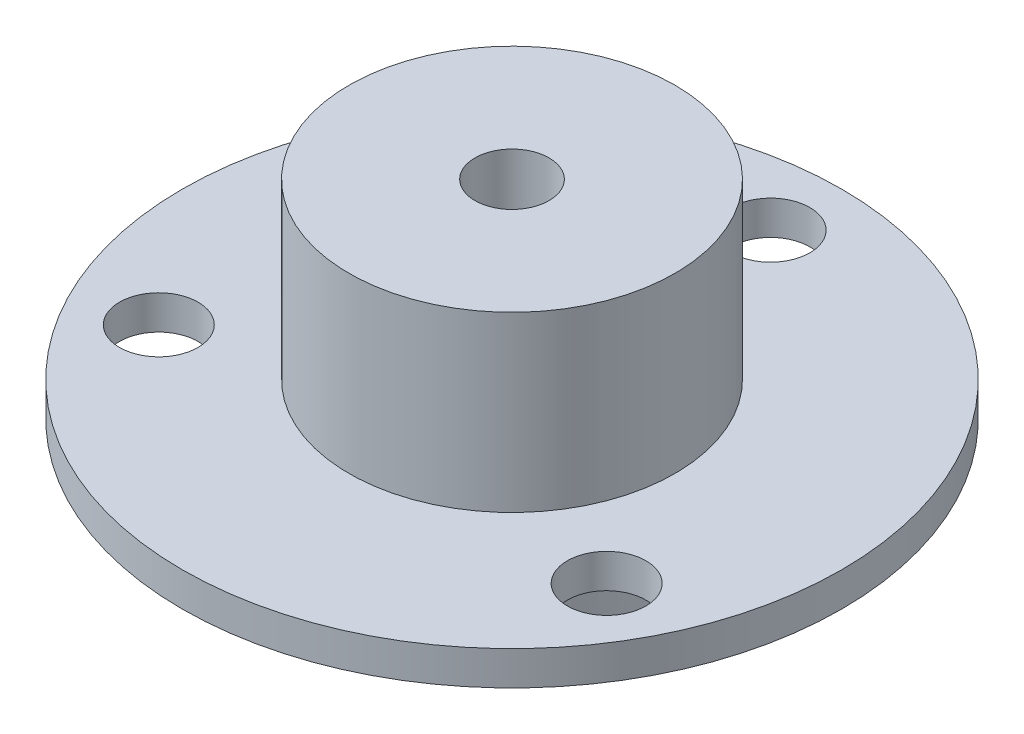
ISO-10303-21;
HEADER;
FILE_DESCRIPTION(('STEP AP214'),'2;1');
FILE_NAME('part.step','',(''),(''),'','','');
FILE_SCHEMA(('AUTOMOTIVE_DESIGN { 1 0 10303 214 1 1 1 1 }'));
ENDSEC;
DATA;
#1=APPLICATION_CONTEXT('core data for automotive mechanical design processes');
#2=APPLICATION_PROTOCOL_DEFINITION('international standard','automotive_design',2000,#1);
#3=PRODUCT_CONTEXT('',#1,'mechanical');
#4=PRODUCT('Part','Part','',(#3));
#5=PRODUCT_RELATED_PRODUCT_CATEGORY('part','',(#4));
#6=PRODUCT_DEFINITION_FORMATION('','',#4);
#7=PRODUCT_DEFINITION_CONTEXT('part definition',#1,'design');
#8=PRODUCT_DEFINITION('design','',#6,#7);
#9=PRODUCT_DEFINITION_SHAPE('','',#8);
#10=(LENGTH_UNIT() NAMED_UNIT(*) SI_UNIT(.MILLI.,.METRE.));
#11=(NAMED_UNIT(*) PLANE_ANGLE_UNIT() SI_UNIT($,.RADIAN.));
#12=(NAMED_UNIT(*) SI_UNIT($,.STERADIAN.) SOLID_ANGLE_UNIT());
#13=UNCERTAINTY_MEASURE_WITH_UNIT(LENGTH_MEASURE(1.E-05),#10,'distance_accuracy_value','');
#14=(GEOMETRIC_REPRESENTATION_CONTEXT(3) GLOBAL_UNCERTAINTY_ASSIGNED_CONTEXT((#13)) GLOBAL_UNIT_ASSIGNED_CONTEXT((#10,
#11,#12)) REPRESENTATION_CONTEXT('',''));
#15=CARTESIAN_POINT('',(0.,0.,0.));
#16=DIRECTION('',(0.,0.,1.));
#17=DIRECTION('',(1.,0.,0.));
#18=AXIS2_PLACEMENT_3D('',#15,#16,#17);
#19=CARTESIAN_POINT('',(0.,0.,0.));
#20=DIRECTION('',(0.,-1.,0.));
#21=DIRECTION('',(0.,0.,-1.));
#22=AXIS2_PLACEMENT_3D('',#19,#20,#21);
#23=CYLINDRICAL_SURFACE('',#22,2.5);
#24=CARTESIAN_POINT('',(0.,0.,0.));
#25=DIRECTION('',(0.,-1.,0.));
#26=DIRECTION('',(0.,0.,-1.));
#27=AXIS2_PLACEMENT_3D('',#24,#25,#26);
#28=CIRCLE('',#27,2.5);
#29=CARTESIAN_POINT('',(0.,0.,-2.5));
#30=VERTEX_POINT('',#29);
#31=EDGE_CURVE('E66',#30,#30,#28,.T.);
#32=ORIENTED_EDGE('',*,*,#31,.T.);
#33=EDGE_LOOP('',(#32));
#34=FACE_BOUND('',#33,.T.);
#35=CARTESIAN_POINT('',(0.,19.,0.));
#36=DIRECTION('',(0.,-1.,0.));
#37=DIRECTION('',(0.,0.,-1.));
#38=AXIS2_PLACEMENT_3D('',#35,#36,#37);
#39=CIRCLE('',#38,2.5);
#40=CARTESIAN_POINT('',(0.,19.,-2.5));
#41=VERTEX_POINT('',#40);
#42=EDGE_CURVE('E10',#41,#41,#39,.T.);
#43=ORIENTED_EDGE('',*,*,#42,.F.);
#44=EDGE_LOOP('',(#43));
#45=FACE_BOUND('',#44,.T.);
#46=ADVANCED_FACE('F37',(#34,#45),#23,.F.);
#47=CARTESIAN_POINT('',(0.,19.,0.));
#48=DIRECTION('',(0.,-1.,0.));
#49=DIRECTION('',(0.,0.,-1.));
#50=AXIS2_PLACEMENT_3D('',#47,#48,#49);
#51=PLANE('',#50);
#52=CARTESIAN_POINT('',(0.,19.,0.));
#53=DIRECTION('',(0.,-1.,0.));
#54=DIRECTION('',(0.,0.,-1.));
#55=AXIS2_PLACEMENT_3D('',#52,#53,#54);
#56=CIRCLE('',#55,11.);
#57=CARTESIAN_POINT('',(0.,19.,-11.));
#58=VERTEX_POINT('',#57);
#59=EDGE_CURVE('E45',#58,#58,#56,.T.);
#60=ORIENTED_EDGE('',*,*,#59,.F.);
#61=EDGE_LOOP('',(#60));
#62=FACE_BOUND('',#61,.T.);
#63=ORIENTED_EDGE('',*,*,#42,.T.);
#64=EDGE_LOOP('',(#63));
#65=FACE_BOUND('',#64,.T.);
#66=ADVANCED_FACE('F102',(#62,#65),#51,.F.);
#67=CARTESIAN_POINT('',(0.,0.,0.));
#68=DIRECTION('',(0.,-1.,0.));
#69=DIRECTION('',(0.,0.,-1.));
#70=AXIS2_PLACEMENT_3D('',#67,#68,#69);
#71=CYLINDRICAL_SURFACE('',#70,11.);
#72=CARTESIAN_POINT('',(0.,7.3,0.));
#73=DIRECTION('',(0.,-1.,0.));
#74=DIRECTION('',(0.,0.,-1.));
#75=AXIS2_PLACEMENT_3D('',#72,#73,#74);
#76=CIRCLE('',#75,11.);
#77=CARTESIAN_POINT('',(0.,7.3,-11.));
#78=VERTEX_POINT('',#77);
#79=EDGE_CURVE('E51',#78,#78,#76,.T.);
#80=ORIENTED_EDGE('',*,*,#79,.F.);
#81=EDGE_LOOP('',(#80));
#82=FACE_BOUND('',#81,.T.);
#83=ORIENTED_EDGE('',*,*,#59,.T.);
#84=EDGE_LOOP('',(#83));
#85=FACE_BOUND('',#84,.T.);
#86=ADVANCED_FACE('F99',(#82,#85),#71,.T.);
#87=CARTESIAN_POINT('',(0.,7.3,0.));
#88=DIRECTION('',(0.,-1.,0.));
#89=DIRECTION('',(0.,0.,-1.));
#90=AXIS2_PLACEMENT_3D('',#87,#88,#89);
#91=PLANE('',#90);
#92=CARTESIAN_POINT('',(0.,7.3,-17.45));
#93=DIRECTION('',(0.,1.,0.));
#94=DIRECTION('',(0.,0.,1.));
#95=AXIS2_PLACEMENT_3D('',#92,#93,#94);
#96=CIRCLE('',#95,2.65);
#97=CARTESIAN_POINT('',(0.,7.3,-14.8));
#98=VERTEX_POINT('',#97);
#99=EDGE_CURVE('E59',#98,#98,#96,.T.);
#100=ORIENTED_EDGE('',*,*,#99,.F.);
#101=EDGE_LOOP('',(#100));
#102=FACE_BOUND('',#101,.T.);
#103=CARTESIAN_POINT('',(15.1121432960385,7.3,8.725));
#104=DIRECTION('',(0.,1.,0.));
#105=DIRECTION('',(0.,0.,1.));
#106=AXIS2_PLACEMENT_3D('',#103,#104,#105);
#107=CIRCLE('',#106,2.65);
#108=CARTESIAN_POINT('',(15.1121432960385,7.3,11.375));
#109=VERTEX_POINT('',#108);
#110=EDGE_CURVE('E146',#109,#109,#107,.T.);
#111=ORIENTED_EDGE('',*,*,#110,.F.);
#112=EDGE_LOOP('',(#111));
#113=FACE_BOUND('',#112,.T.);
#114=CARTESIAN_POINT('',(-15.1121432960385,7.3,8.72500000000001));
#115=DIRECTION('',(0.,1.,0.));
#116=DIRECTION('',(0.,0.,1.));
#117=AXIS2_PLACEMENT_3D('',#114,#115,#116);
#118=CIRCLE('',#117,2.65);
#119=CARTESIAN_POINT('',(-15.1121432960385,7.3,11.375));
#120=VERTEX_POINT('',#119);
#121=EDGE_CURVE('E80',#120,#120,#118,.T.);
#122=ORIENTED_EDGE('',*,*,#121,.F.);
#123=EDGE_LOOP('',(#122));
#124=FACE_BOUND('',#123,.T.);
#125=CARTESIAN_POINT('',(0.,7.3,0.));
#126=DIRECTION('',(0.,-1.,0.));
#127=DIRECTION('',(0.,0.,-1.));
#128=AXIS2_PLACEMENT_3D('',#125,#126,#127);
#129=CIRCLE('',#128,22.25);
#130=CARTESIAN_POINT('',(0.,7.3,-22.25));
#131=VERTEX_POINT('',#130);
#132=EDGE_CURVE('E90',#131,#131,#129,.T.);
#133=ORIENTED_EDGE('',*,*,#132,.F.);
#134=EDGE_LOOP('',(#133));
#135=FACE_BOUND('',#134,.T.);
#136=ORIENTED_EDGE('',*,*,#79,.T.);
#137=EDGE_LOOP('',(#136));
#138=FACE_BOUND('',#137,.T.);
#139=ADVANCED_FACE('F97',(#102,#113,#124,#135,#138),#91,.F.);
#140=CARTESIAN_POINT('',(0.,0.,0.));
#141=DIRECTION('',(0.,-1.,0.));
#142=DIRECTION('',(0.,0.,-1.));
#143=AXIS2_PLACEMENT_3D('',#140,#141,#142);
#144=CYLINDRICAL_SURFACE('',#143,22.25);
#145=CARTESIAN_POINT('',(0.,5.,0.));
#146=DIRECTION('',(0.,-1.,0.));
#147=DIRECTION('',(0.,0.,-1.));
#148=AXIS2_PLACEMENT_3D('',#145,#146,#147);
#149=CIRCLE('',#148,22.25);
#150=CARTESIAN_POINT('',(0.,5.,-22.25));
#151=VERTEX_POINT('',#150);
#152=EDGE_CURVE('E86',#151,#151,#149,.T.);
#153=ORIENTED_EDGE('',*,*,#152,.F.);
#154=EDGE_LOOP('',(#153));
#155=FACE_BOUND('',#154,.T.);
#156=ORIENTED_EDGE('',*,*,#132,.T.);
#157=EDGE_LOOP('',(#156));
#158=FACE_BOUND('',#157,.T.);
#159=ADVANCED_FACE('F113',(#155,#158),#144,.T.);
#160=CARTESIAN_POINT('',(0.,5.,0.));
#161=DIRECTION('',(0.,1.,0.));
#162=DIRECTION('',(0.,0.,1.));
#163=AXIS2_PLACEMENT_3D('',#160,#161,#162);
#164=PLANE('',#163);
#165=CARTESIAN_POINT('',(0.,5.,-17.45));
#166=DIRECTION('',(0.,1.,0.));
#167=DIRECTION('',(0.,0.,1.));
#168=AXIS2_PLACEMENT_3D('',#165,#166,#167);
#169=CIRCLE('',#168,2.65);
#170=CARTESIAN_POINT('',(0.,5.,-14.8));
#171=VERTEX_POINT('',#170);
#172=EDGE_CURVE('E40',#171,#171,#169,.T.);
#173=ORIENTED_EDGE('',*,*,#172,.T.);
#174=EDGE_LOOP('',(#173));
#175=FACE_BOUND('',#174,.T.);
#176=CARTESIAN_POINT('',(15.1121432960385,5.,8.725));
#177=DIRECTION('',(0.,1.,0.));
#178=DIRECTION('',(0.,0.,1.));
#179=AXIS2_PLACEMENT_3D('',#176,#177,#178);
#180=CIRCLE('',#179,2.65);
#181=CARTESIAN_POINT('',(15.1121432960385,5.,11.375));
#182=VERTEX_POINT('',#181);
#183=EDGE_CURVE('E58',#182,#182,#180,.T.);
#184=ORIENTED_EDGE('',*,*,#183,.T.);
#185=EDGE_LOOP('',(#184));
#186=FACE_BOUND('',#185,.T.);
#187=CARTESIAN_POINT('',(-15.1121432960385,5.,8.72500000000001));
#188=DIRECTION('',(0.,1.,0.));
#189=DIRECTION('',(0.,0.,1.));
#190=AXIS2_PLACEMENT_3D('',#187,#188,#189);
#191=CIRCLE('',#190,2.65);
#192=CARTESIAN_POINT('',(-15.1121432960385,5.,11.375));
#193=VERTEX_POINT('',#192);
#194=EDGE_CURVE('E55',#193,#193,#191,.T.);
#195=ORIENTED_EDGE('',*,*,#194,.T.);
#196=EDGE_LOOP('',(#195));
#197=FACE_BOUND('',#196,.T.);
#198=CARTESIAN_POINT('',(0.,5.,0.));
#199=DIRECTION('',(0.,-1.,0.));
#200=DIRECTION('',(0.,0.,-1.));
#201=AXIS2_PLACEMENT_3D('',#198,#199,#200);
#202=CIRCLE('',#201,11.);
#203=CARTESIAN_POINT('',(0.,5.,-11.));
#204=VERTEX_POINT('',#203);
#205=EDGE_CURVE('E77',#204,#204,#202,.T.);
#206=ORIENTED_EDGE('',*,*,#205,.F.);
#207=EDGE_LOOP('',(#206));
#208=FACE_BOUND('',#207,.T.);
#209=ORIENTED_EDGE('',*,*,#152,.T.);
#210=EDGE_LOOP('',(#209));
#211=FACE_BOUND('',#210,.T.);
#212=ADVANCED_FACE('F117',(#175,#186,#197,#208,#211),#164,.F.);
#213=CARTESIAN_POINT('',(0.,0.,0.));
#214=DIRECTION('',(0.,-1.,0.));
#215=DIRECTION('',(0.,0.,-1.));
#216=AXIS2_PLACEMENT_3D('',#213,#214,#215);
#217=CYLINDRICAL_SURFACE('',#216,11.);
#218=CARTESIAN_POINT('',(0.,0.,0.));
#219=DIRECTION('',(0.,-1.,0.));
#220=DIRECTION('',(0.,0.,-1.));
#221=AXIS2_PLACEMENT_3D('',#218,#219,#220);
#222=CIRCLE('',#221,11.);
#223=CARTESIAN_POINT('',(0.,0.,-11.));
#224=VERTEX_POINT('',#223);
#225=EDGE_CURVE('E71',#224,#224,#222,.T.);
#226=ORIENTED_EDGE('',*,*,#225,.F.);
#227=EDGE_LOOP('',(#226));
#228=FACE_BOUND('',#227,.T.);
#229=ORIENTED_EDGE('',*,*,#205,.T.);
#230=EDGE_LOOP('',(#229));
#231=FACE_BOUND('',#230,.T.);
#232=ADVANCED_FACE('F121',(#228,#231),#217,.T.);
#233=CARTESIAN_POINT('',(0.,0.,0.));
#234=DIRECTION('',(0.,1.,0.));
#235=DIRECTION('',(0.,0.,1.));
#236=AXIS2_PLACEMENT_3D('',#233,#234,#235);
#237=PLANE('',#236);
#238=ORIENTED_EDGE('',*,*,#31,.F.);
#239=EDGE_LOOP('',(#238));
#240=FACE_BOUND('',#239,.T.);
#241=ORIENTED_EDGE('',*,*,#225,.T.);
#242=EDGE_LOOP('',(#241));
#243=FACE_BOUND('',#242,.T.);
#244=ADVANCED_FACE('F124',(#240,#243),#237,.F.);
#245=CARTESIAN_POINT('',(-15.1121432960385,0.,8.72500000000001));
#246=DIRECTION('',(0.,1.,0.));
#247=DIRECTION('',(0.,0.,1.));
#248=AXIS2_PLACEMENT_3D('',#245,#246,#247);
#249=CYLINDRICAL_SURFACE('',#248,2.65);
#250=CARTESIAN_POINT('',(-15.1121432960385,7.3,11.375));
#251=CARTESIAN_POINT('',(-15.1121432960385,7.27604166666667,11.375));
#252=CARTESIAN_POINT('',(-15.1121432960385,7.25208333333333,11.375));
#253=CARTESIAN_POINT('',(-15.1121432960385,7.20416666666667,11.375));
#254=CARTESIAN_POINT('',(-15.1121432960385,7.18020833333333,11.375));
#255=CARTESIAN_POINT('',(-15.1121432960385,7.13229166666667,11.375));
#256=CARTESIAN_POINT('',(-15.1121432960385,7.10833333333333,11.375));
#257=CARTESIAN_POINT('',(-15.1121432960385,7.06041666666667,11.375));
#258=CARTESIAN_POINT('',(-15.1121432960385,7.03645833333333,11.375));
#259=CARTESIAN_POINT('',(-15.1121432960385,6.98854166666667,11.375));
#260=CARTESIAN_POINT('',(-15.1121432960385,6.96458333333333,11.375));
#261=CARTESIAN_POINT('',(-15.1121432960385,6.91666666666667,11.375));
#262=CARTESIAN_POINT('',(-15.1121432960385,6.89270833333333,11.375));
#263=CARTESIAN_POINT('',(-15.1121432960385,6.84479166666667,11.375));
#264=CARTESIAN_POINT('',(-15.1121432960385,6.82083333333333,11.375));
#265=CARTESIAN_POINT('',(-15.1121432960385,6.77291666666667,11.375));
#266=CARTESIAN_POINT('',(-15.1121432960385,6.74895833333333,11.375));
#267=CARTESIAN_POINT('',(-15.1121432960385,6.70104166666667,11.375));
#268=CARTESIAN_POINT('',(-15.1121432960385,6.67708333333333,11.375));
#269=CARTESIAN_POINT('',(-15.1121432960385,6.62916666666667,11.375));
#270=CARTESIAN_POINT('',(-15.1121432960385,6.60520833333333,11.375));
#271=CARTESIAN_POINT('',(-15.1121432960385,6.55729166666667,11.375));
#272=CARTESIAN_POINT('',(-15.1121432960385,6.53333333333333,11.375));
#273=CARTESIAN_POINT('',(-15.1121432960385,6.48541666666667,11.375));
#274=CARTESIAN_POINT('',(-15.1121432960385,6.46145833333333,11.375));
#275=CARTESIAN_POINT('',(-15.1121432960385,6.41354166666667,11.375));
#276=CARTESIAN_POINT('',(-15.1121432960385,6.38958333333333,11.375));
#277=CARTESIAN_POINT('',(-15.1121432960385,6.34166666666667,11.375));
#278=CARTESIAN_POINT('',(-15.1121432960385,6.31770833333333,11.375));
#279=CARTESIAN_POINT('',(-15.1121432960385,6.26979166666667,11.375));
#280=CARTESIAN_POINT('',(-15.1121432960385,6.24583333333333,11.375));
#281=CARTESIAN_POINT('',(-15.1121432960385,6.19791666666667,11.375));
#282=CARTESIAN_POINT('',(-15.1121432960385,6.17395833333333,11.375));
#283=CARTESIAN_POINT('',(-15.1121432960385,6.12604166666667,11.375));
#284=CARTESIAN_POINT('',(-15.1121432960385,6.10208333333333,11.375));
#285=CARTESIAN_POINT('',(-15.1121432960385,6.05416666666667,11.375));
#286=CARTESIAN_POINT('',(-15.1121432960385,6.03020833333333,11.375));
#287=CARTESIAN_POINT('',(-15.1121432960385,5.98229166666667,11.375));
#288=CARTESIAN_POINT('',(-15.1121432960385,5.95833333333333,11.375));
#289=CARTESIAN_POINT('',(-15.1121432960385,5.91041666666667,11.375));
#290=CARTESIAN_POINT('',(-15.1121432960385,5.88645833333333,11.375));
#291=CARTESIAN_POINT('',(-15.1121432960385,5.83854166666667,11.375));
#292=CARTESIAN_POINT('',(-15.1121432960385,5.81458333333333,11.375));
#293=CARTESIAN_POINT('',(-15.1121432960385,5.76666666666667,11.375));
#294=CARTESIAN_POINT('',(-15.1121432960385,5.74270833333333,11.375));
#295=CARTESIAN_POINT('',(-15.1121432960385,5.69479166666667,11.375));
#296=CARTESIAN_POINT('',(-15.1121432960385,5.67083333333333,11.375));
#297=CARTESIAN_POINT('',(-15.1121432960385,5.62291666666667,11.375));
#298=CARTESIAN_POINT('',(-15.1121432960385,5.59895833333333,11.375));
#299=CARTESIAN_POINT('',(-15.1121432960385,5.55104166666667,11.375));
#300=CARTESIAN_POINT('',(-15.1121432960385,5.52708333333333,11.375));
#301=CARTESIAN_POINT('',(-15.1121432960385,5.47916666666667,11.375));
#302=CARTESIAN_POINT('',(-15.1121432960385,5.45520833333333,11.375));
#303=CARTESIAN_POINT('',(-15.1121432960385,5.40729166666667,11.375));
#304=CARTESIAN_POINT('',(-15.1121432960385,5.38333333333333,11.375));
#305=CARTESIAN_POINT('',(-15.1121432960385,5.33541666666667,11.375));
#306=CARTESIAN_POINT('',(-15.1121432960385,5.31145833333333,11.375));
#307=CARTESIAN_POINT('',(-15.1121432960385,5.26354166666667,11.375));
#308=CARTESIAN_POINT('',(-15.1121432960385,5.23958333333333,11.375));
#309=CARTESIAN_POINT('',(-15.1121432960385,5.19166666666667,11.375));
#310=CARTESIAN_POINT('',(-15.1121432960385,5.16770833333333,11.375));
#311=CARTESIAN_POINT('',(-15.1121432960385,5.11979166666667,11.375));
#312=CARTESIAN_POINT('',(-15.1121432960385,5.09583333333333,11.375));
#313=CARTESIAN_POINT('',(-15.1121432960385,5.04791666666667,11.375));
#314=CARTESIAN_POINT('',(-15.1121432960385,5.02395833333333,11.375));
#315=CARTESIAN_POINT('',(-15.1121432960385,5.,11.375));
#316=B_SPLINE_CURVE_WITH_KNOTS('',3,(#250,#251,#252,#253,#254,#255,#256,#257,#258,#259,#260,
#261,#262,#263,#264,#265,#266,#267,#268,#269,#270,#271,#272,#273,#274,#275,#276,#277,#278,#279,
#280,#281,#282,#283,#284,#285,#286,#287,#288,#289,#290,#291,#292,#293,#294,#295,#296,#297,#298,
#299,#300,#301,#302,#303,#304,#305,#306,#307,#308,#309,#310,#311,#312,#313,#314,#315),
.UNSPECIFIED.,.F.,.F.,(4,2,2,2,2,2,2,2,2,2,2,2,2,2,2,2,2,2,2,2,2,2,2,2,2,2,2,2,2,2,2,2,4),(0.,
0.0718749999999999,0.14375,0.215625,0.2875,0.359375,0.43125,0.503125,0.575,0.646875,0.71875,
0.790625,0.8625,0.934375,1.00625,1.078125,1.15,1.221875,1.29375,1.365625,1.4375,1.509375,
1.58125,1.653125,1.725,1.796875,1.86875,1.940625,2.0125,2.084375,2.15625,2.228125,2.3),.UNSPECIFIED.);
#317=EDGE_CURVE('BSEAM128',#120,#193,#316,.T.);
#318=ORIENTED_EDGE('',*,*,#121,.T.);
#319=ORIENTED_EDGE('',*,*,#194,.F.);
#320=ORIENTED_EDGE('',*,*,#317,.T.);
#321=ORIENTED_EDGE('',*,*,#317,.F.);
#322=EDGE_LOOP('',(#318,#320,#319,#321));
#323=FACE_BOUND('',#322,.T.);
#324=ADVANCED_FACE('F128',(#323),#249,.F.);
#325=CARTESIAN_POINT('',(15.1121432960385,0.,8.725));
#326=DIRECTION('',(0.,1.,0.));
#327=DIRECTION('',(0.,0.,1.));
#328=AXIS2_PLACEMENT_3D('',#325,#326,#327);
#329=CYLINDRICAL_SURFACE('',#328,2.65);
#330=CARTESIAN_POINT('',(15.1121432960385,7.3,11.375));
#331=CARTESIAN_POINT('',(15.1121432960385,7.27604166666667,11.375));
#332=CARTESIAN_POINT('',(15.1121432960385,7.25208333333333,11.375));
#333=CARTESIAN_POINT('',(15.1121432960385,7.20416666666667,11.375));
#334=CARTESIAN_POINT('',(15.1121432960385,7.18020833333333,11.375));
#335=CARTESIAN_POINT('',(15.1121432960385,7.13229166666667,11.375));
#336=CARTESIAN_POINT('',(15.1121432960385,7.10833333333333,11.375));
#337=CARTESIAN_POINT('',(15.1121432960385,7.06041666666667,11.375));
#338=CARTESIAN_POINT('',(15.1121432960385,7.03645833333333,11.375));
#339=CARTESIAN_POINT('',(15.1121432960385,6.98854166666667,11.375));
#340=CARTESIAN_POINT('',(15.1121432960385,6.96458333333333,11.375));
#341=CARTESIAN_POINT('',(15.1121432960385,6.91666666666667,11.375));
#342=CARTESIAN_POINT('',(15.1121432960385,6.89270833333333,11.375));
#343=CARTESIAN_POINT('',(15.1121432960385,6.84479166666667,11.375));
#344=CARTESIAN_POINT('',(15.1121432960385,6.82083333333333,11.375));
#345=CARTESIAN_POINT('',(15.1121432960385,6.77291666666667,11.375));
#346=CARTESIAN_POINT('',(15.1121432960385,6.74895833333333,11.375));
#347=CARTESIAN_POINT('',(15.1121432960385,6.70104166666667,11.375));
#348=CARTESIAN_POINT('',(15.1121432960385,6.67708333333333,11.375));
#349=CARTESIAN_POINT('',(15.1121432960385,6.62916666666667,11.375));
#350=CARTESIAN_POINT('',(15.1121432960385,6.60520833333333,11.375));
#351=CARTESIAN_POINT('',(15.1121432960385,6.55729166666667,11.375));
#352=CARTESIAN_POINT('',(15.1121432960385,6.53333333333333,11.375));
#353=CARTESIAN_POINT('',(15.1121432960385,6.48541666666667,11.375));
#354=CARTESIAN_POINT('',(15.1121432960385,6.46145833333333,11.375));
#355=CARTESIAN_POINT('',(15.1121432960385,6.41354166666667,11.375));
#356=CARTESIAN_POINT('',(15.1121432960385,6.38958333333333,11.375));
#357=CARTESIAN_POINT('',(15.1121432960385,6.34166666666667,11.375));
#358=CARTESIAN_POINT('',(15.1121432960385,6.31770833333333,11.375));
#359=CARTESIAN_POINT('',(15.1121432960385,6.26979166666667,11.375));
#360=CARTESIAN_POINT('',(15.1121432960385,6.24583333333333,11.375));
#361=CARTESIAN_POINT('',(15.1121432960385,6.19791666666667,11.375));
#362=CARTESIAN_POINT('',(15.1121432960385,6.17395833333333,11.375));
#363=CARTESIAN_POINT('',(15.1121432960385,6.12604166666667,11.375));
#364=CARTESIAN_POINT('',(15.1121432960385,6.10208333333333,11.375));
#365=CARTESIAN_POINT('',(15.1121432960385,6.05416666666667,11.375));
#366=CARTESIAN_POINT('',(15.1121432960385,6.03020833333333,11.375));
#367=CARTESIAN_POINT('',(15.1121432960385,5.98229166666667,11.375));
#368=CARTESIAN_POINT('',(15.1121432960385,5.95833333333333,11.375));
#369=CARTESIAN_POINT('',(15.1121432960385,5.91041666666667,11.375));
#370=CARTESIAN_POINT('',(15.1121432960385,5.88645833333333,11.375));
#371=CARTESIAN_POINT('',(15.1121432960385,5.83854166666667,11.375));
#372=CARTESIAN_POINT('',(15.1121432960385,5.81458333333333,11.375));
#373=CARTESIAN_POINT('',(15.1121432960385,5.76666666666667,11.375));
#374=CARTESIAN_POINT('',(15.1121432960385,5.74270833333333,11.375));
#375=CARTESIAN_POINT('',(15.1121432960385,5.69479166666667,11.375));
#376=CARTESIAN_POINT('',(15.1121432960385,5.67083333333333,11.375));
#377=CARTESIAN_POINT('',(15.1121432960385,5.62291666666667,11.375));
#378=CARTESIAN_POINT('',(15.1121432960385,5.59895833333333,11.375));
#379=CARTESIAN_POINT('',(15.1121432960385,5.55104166666667,11.375));
#380=CARTESIAN_POINT('',(15.1121432960385,5.52708333333333,11.375));
#381=CARTESIAN_POINT('',(15.1121432960385,5.47916666666667,11.375));
#382=CARTESIAN_POINT('',(15.1121432960385,5.45520833333333,11.375));
#383=CARTESIAN_POINT('',(15.1121432960385,5.40729166666667,11.375));
#384=CARTESIAN_POINT('',(15.1121432960385,5.38333333333333,11.375));
#385=CARTESIAN_POINT('',(15.1121432960385,5.33541666666667,11.375));
#386=CARTESIAN_POINT('',(15.1121432960385,5.31145833333333,11.375));
#387=CARTESIAN_POINT('',(15.1121432960385,5.26354166666667,11.375));
#388=CARTESIAN_POINT('',(15.1121432960385,5.23958333333333,11.375));
#389=CARTESIAN_POINT('',(15.1121432960385,5.19166666666667,11.375));
#390=CARTESIAN_POINT('',(15.1121432960385,5.16770833333333,11.375));
#391=CARTESIAN_POINT('',(15.1121432960385,5.11979166666667,11.375));
#392=CARTESIAN_POINT('',(15.1121432960385,5.09583333333333,11.375));
#393=CARTESIAN_POINT('',(15.1121432960385,5.04791666666667,11.375));
#394=CARTESIAN_POINT('',(15.1121432960385,5.02395833333333,11.375));
#395=CARTESIAN_POINT('',(15.1121432960385,5.,11.375));
#396=B_SPLINE_CURVE_WITH_KNOTS('',3,(#330,#331,#332,#333,#334,#335,#336,#337,#338,#339,#340,
#341,#342,#343,#344,#345,#346,#347,#348,#349,#350,#351,#352,#353,#354,#355,#356,#357,#358,#359,
#360,#361,#362,#363,#364,#365,#366,#367,#368,#369,#370,#371,#372,#373,#374,#375,#376,#377,#378,
#379,#380,#381,#382,#383,#384,#385,#386,#387,#388,#389,#390,#391,#392,#393,#394,#395),
.UNSPECIFIED.,.F.,.F.,(4,2,2,2,2,2,2,2,2,2,2,2,2,2,2,2,2,2,2,2,2,2,2,2,2,2,2,2,2,2,2,2,4),(0.,
0.0718749999999999,0.14375,0.215625,0.2875,0.359375,0.43125,0.503125,0.575,0.646875,0.71875,
0.790625,0.8625,0.934375,1.00625,1.078125,1.15,1.221875,1.29375,1.365625,1.4375,1.509375,
1.58125,1.653125,1.725,1.796875,1.86875,1.940625,2.0125,2.084375,2.15625,2.228125,2.3),.UNSPECIFIED.);
#397=EDGE_CURVE('BSEAM132',#109,#182,#396,.T.);
#398=ORIENTED_EDGE('',*,*,#110,.T.);
#399=ORIENTED_EDGE('',*,*,#183,.F.);
#400=ORIENTED_EDGE('',*,*,#397,.T.);
#401=ORIENTED_EDGE('',*,*,#397,.F.);
#402=EDGE_LOOP('',(#398,#400,#399,#401));
#403=FACE_BOUND('',#402,.T.);
#404=ADVANCED_FACE('F132',(#403),#329,.F.);
#405=CARTESIAN_POINT('',(0.,0.,-17.45));
#406=DIRECTION('',(0.,1.,0.));
#407=DIRECTION('',(0.,0.,1.));
#408=AXIS2_PLACEMENT_3D('',#405,#406,#407);
#409=CYLINDRICAL_SURFACE('',#408,2.65);
#410=CARTESIAN_POINT('',(0.,7.3,-14.8));
#411=CARTESIAN_POINT('',(0.,7.27604166666667,-14.8));
#412=CARTESIAN_POINT('',(0.,7.25208333333333,-14.8));
#413=CARTESIAN_POINT('',(0.,7.20416666666667,-14.8));
#414=CARTESIAN_POINT('',(0.,7.18020833333333,-14.8));
#415=CARTESIAN_POINT('',(0.,7.13229166666667,-14.8));
#416=CARTESIAN_POINT('',(0.,7.10833333333333,-14.8));
#417=CARTESIAN_POINT('',(0.,7.06041666666667,-14.8));
#418=CARTESIAN_POINT('',(0.,7.03645833333333,-14.8));
#419=CARTESIAN_POINT('',(0.,6.98854166666667,-14.8));
#420=CARTESIAN_POINT('',(0.,6.96458333333333,-14.8));
#421=CARTESIAN_POINT('',(0.,6.91666666666667,-14.8));
#422=CARTESIAN_POINT('',(0.,6.89270833333333,-14.8));
#423=CARTESIAN_POINT('',(0.,6.84479166666667,-14.8));
#424=CARTESIAN_POINT('',(0.,6.82083333333333,-14.8));
#425=CARTESIAN_POINT('',(0.,6.77291666666667,-14.8));
#426=CARTESIAN_POINT('',(0.,6.74895833333333,-14.8));
#427=CARTESIAN_POINT('',(0.,6.70104166666667,-14.8));
#428=CARTESIAN_POINT('',(0.,6.67708333333333,-14.8));
#429=CARTESIAN_POINT('',(0.,6.62916666666667,-14.8));
#430=CARTESIAN_POINT('',(0.,6.60520833333333,-14.8));
#431=CARTESIAN_POINT('',(0.,6.55729166666667,-14.8));
#432=CARTESIAN_POINT('',(0.,6.53333333333333,-14.8));
#433=CARTESIAN_POINT('',(0.,6.48541666666667,-14.8));
#434=CARTESIAN_POINT('',(0.,6.46145833333333,-14.8));
#435=CARTESIAN_POINT('',(0.,6.41354166666667,-14.8));
#436=CARTESIAN_POINT('',(0.,6.38958333333333,-14.8));
#437=CARTESIAN_POINT('',(0.,6.34166666666667,-14.8));
#438=CARTESIAN_POINT('',(0.,6.31770833333333,-14.8));
#439=CARTESIAN_POINT('',(0.,6.26979166666667,-14.8));
#440=CARTESIAN_POINT('',(0.,6.24583333333333,-14.8));
#441=CARTESIAN_POINT('',(0.,6.19791666666667,-14.8));
#442=CARTESIAN_POINT('',(0.,6.17395833333333,-14.8));
#443=CARTESIAN_POINT('',(0.,6.12604166666667,-14.8));
#444=CARTESIAN_POINT('',(0.,6.10208333333333,-14.8));
#445=CARTESIAN_POINT('',(0.,6.05416666666667,-14.8));
#446=CARTESIAN_POINT('',(0.,6.03020833333333,-14.8));
#447=CARTESIAN_POINT('',(0.,5.98229166666667,-14.8));
#448=CARTESIAN_POINT('',(0.,5.95833333333333,-14.8));
#449=CARTESIAN_POINT('',(0.,5.91041666666667,-14.8));
#450=CARTESIAN_POINT('',(0.,5.88645833333333,-14.8));
#451=CARTESIAN_POINT('',(0.,5.83854166666667,-14.8));
#452=CARTESIAN_POINT('',(0.,5.81458333333333,-14.8));
#453=CARTESIAN_POINT('',(0.,5.76666666666667,-14.8));
#454=CARTESIAN_POINT('',(0.,5.74270833333333,-14.8));
#455=CARTESIAN_POINT('',(0.,5.69479166666667,-14.8));
#456=CARTESIAN_POINT('',(0.,5.67083333333333,-14.8));
#457=CARTESIAN_POINT('',(0.,5.62291666666667,-14.8));
#458=CARTESIAN_POINT('',(0.,5.59895833333333,-14.8));
#459=CARTESIAN_POINT('',(0.,5.55104166666667,-14.8));
#460=CARTESIAN_POINT('',(0.,5.52708333333333,-14.8));
#461=CARTESIAN_POINT('',(0.,5.47916666666667,-14.8));
#462=CARTESIAN_POINT('',(0.,5.45520833333333,-14.8));
#463=CARTESIAN_POINT('',(0.,5.40729166666667,-14.8));
#464=CARTESIAN_POINT('',(0.,5.38333333333333,-14.8));
#465=CARTESIAN_POINT('',(0.,5.33541666666667,-14.8));
#466=CARTESIAN_POINT('',(0.,5.31145833333333,-14.8));
#467=CARTESIAN_POINT('',(0.,5.26354166666667,-14.8));
#468=CARTESIAN_POINT('',(0.,5.23958333333333,-14.8));
#469=CARTESIAN_POINT('',(0.,5.19166666666667,-14.8));
#470=CARTESIAN_POINT('',(0.,5.16770833333333,-14.8));
#471=CARTESIAN_POINT('',(0.,5.11979166666667,-14.8));
#472=CARTESIAN_POINT('',(0.,5.09583333333333,-14.8));
#473=CARTESIAN_POINT('',(0.,5.04791666666667,-14.8));
#474=CARTESIAN_POINT('',(0.,5.02395833333333,-14.8));
#475=CARTESIAN_POINT('',(0.,5.,-14.8));
#476=B_SPLINE_CURVE_WITH_KNOTS('',3,(#410,#411,#412,#413,#414,#415,#416,#417,#418,#419,#420,
#421,#422,#423,#424,#425,#426,#427,#428,#429,#430,#431,#432,#433,#434,#435,#436,#437,#438,#439,
#440,#441,#442,#443,#444,#445,#446,#447,#448,#449,#450,#451,#452,#453,#454,#455,#456,#457,#458,
#459,#460,#461,#462,#463,#464,#465,#466,#467,#468,#469,#470,#471,#472,#473,#474,#475),
.UNSPECIFIED.,.F.,.F.,(4,2,2,2,2,2,2,2,2,2,2,2,2,2,2,2,2,2,2,2,2,2,2,2,2,2,2,2,2,2,2,2,4),(0.,
0.0718749999999999,0.14375,0.215625,0.2875,0.359375,0.43125,0.503125,0.575,0.646875,0.71875,
0.790625,0.8625,0.934375,1.00625,1.078125,1.15,1.221875,1.29375,1.365625,1.4375,1.509375,
1.58125,1.653125,1.725,1.796875,1.86875,1.940625,2.0125,2.084375,2.15625,2.228125,2.3),.UNSPECIFIED.);
#477=EDGE_CURVE('BSEAM136',#98,#171,#476,.T.);
#478=ORIENTED_EDGE('',*,*,#99,.T.);
#479=ORIENTED_EDGE('',*,*,#172,.F.);
#480=ORIENTED_EDGE('',*,*,#477,.T.);
#481=ORIENTED_EDGE('',*,*,#477,.F.);
#482=EDGE_LOOP('',(#478,#480,#479,#481));
#483=FACE_BOUND('',#482,.T.);
#484=ADVANCED_FACE('F136',(#483),#409,.F.);
#485=CLOSED_SHELL('',(#46,#66,#86,#139,#159,#212,#232,#244,#324,#404,#484));
#486=MANIFOLD_SOLID_BREP('B2',#485);
#487=ADVANCED_BREP_SHAPE_REPRESENTATION('',(#18,#486),#14);
#488=SHAPE_DEFINITION_REPRESENTATION(#9,#487);
ENDSEC;
END-ISO-10303-21;
